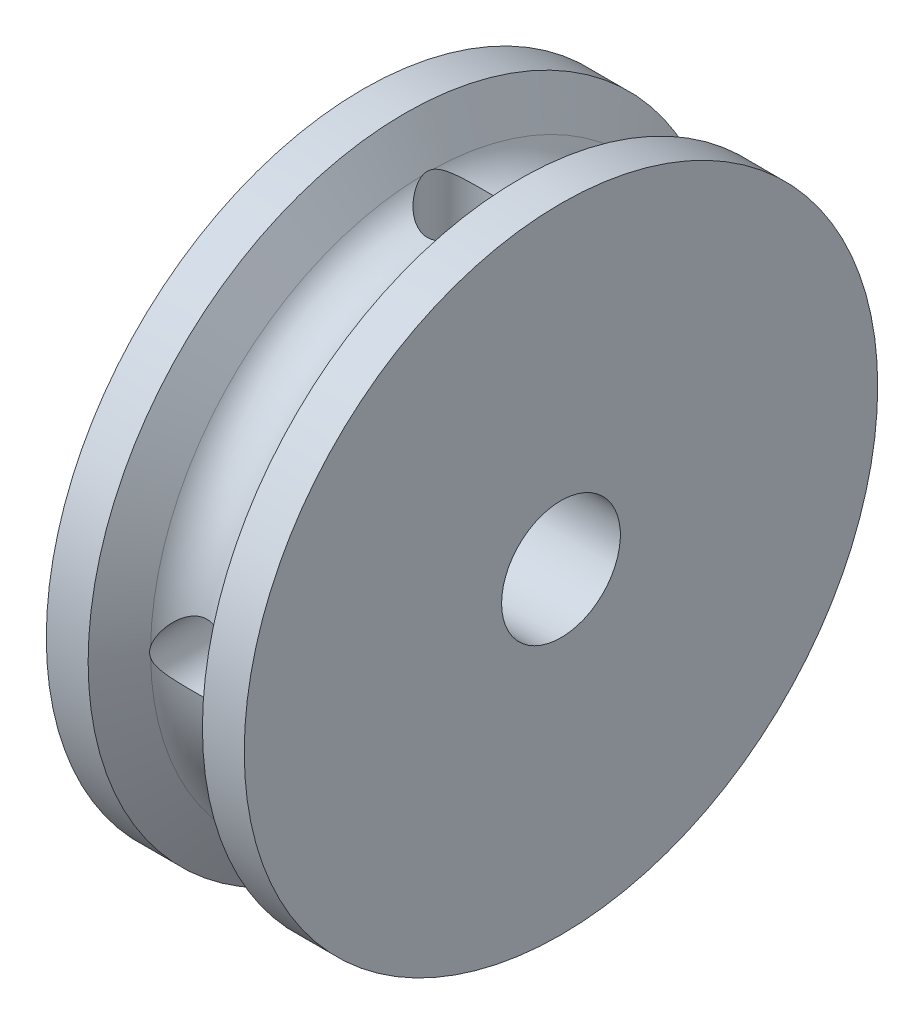
ISO-10303-21;
HEADER;
FILE_DESCRIPTION(('STEP AP214'),'2;1');
FILE_NAME('part.step','',(''),(''),'','','');
FILE_SCHEMA(('AUTOMOTIVE_DESIGN { 1 0 10303 214 1 1 1 1 }'));
ENDSEC;
DATA;
#1=APPLICATION_CONTEXT('core data for automotive mechanical design processes');
#2=APPLICATION_PROTOCOL_DEFINITION('international standard','automotive_design',2000,#1);
#3=PRODUCT_CONTEXT('',#1,'mechanical');
#4=PRODUCT('Part','Part','',(#3));
#5=PRODUCT_RELATED_PRODUCT_CATEGORY('part','',(#4));
#6=PRODUCT_DEFINITION_FORMATION('','',#4);
#7=PRODUCT_DEFINITION_CONTEXT('part definition',#1,'design');
#8=PRODUCT_DEFINITION('design','',#6,#7);
#9=PRODUCT_DEFINITION_SHAPE('','',#8);
#10=(LENGTH_UNIT() NAMED_UNIT(*) SI_UNIT(.MILLI.,.METRE.));
#11=(NAMED_UNIT(*) PLANE_ANGLE_UNIT() SI_UNIT($,.RADIAN.));
#12=(NAMED_UNIT(*) SI_UNIT($,.STERADIAN.) SOLID_ANGLE_UNIT());
#13=UNCERTAINTY_MEASURE_WITH_UNIT(LENGTH_MEASURE(1.E-05),#10,'distance_accuracy_value','');
#14=(GEOMETRIC_REPRESENTATION_CONTEXT(3) GLOBAL_UNCERTAINTY_ASSIGNED_CONTEXT((#13)) GLOBAL_UNIT_ASSIGNED_CONTEXT((#10,
#11,#12)) REPRESENTATION_CONTEXT('',''));
#15=CARTESIAN_POINT('',(0.,0.,0.));
#16=DIRECTION('',(0.,0.,1.));
#17=DIRECTION('',(1.,0.,0.));
#18=AXIS2_PLACEMENT_3D('',#15,#16,#17);
#19=CARTESIAN_POINT('',(2.88675134594812,0.,0.));
#20=DIRECTION('',(1.,0.,0.));
#21=DIRECTION('',(0.,0.,-1.));
#22=AXIS2_PLACEMENT_3D('',#19,#20,#21);
#23=CONICAL_SURFACE('',#22,16.,1.04719755119661);
#24=CARTESIAN_POINT('',(2.88675134594812,0.,0.));
#25=DIRECTION('',(-1.,0.,0.));
#26=DIRECTION('',(0.,0.,1.));
#27=AXIS2_PLACEMENT_3D('',#24,#25,#26);
#28=CIRCLE('',#27,16.);
#29=CARTESIAN_POINT('',(2.88675134594812,0.,16.));
#30=VERTEX_POINT('',#29);
#31=EDGE_CURVE('E103',#30,#30,#28,.T.);
#32=ORIENTED_EDGE('',*,*,#31,.T.);
#33=EDGE_LOOP('',(#32));
#34=FACE_BOUND('',#33,.T.);
#35=CARTESIAN_POINT('',(1.73005588832579,-0.263451367939681,13.9940650589537));
#36=CARTESIAN_POINT('',(1.73361521358024,-0.240085459690031,14.000671144653));
#37=CARTESIAN_POINT('',(1.73673176852176,-0.216426208574894,14.0064561461154));
#38=CARTESIAN_POINT('',(1.74202242324003,-0.168631286114386,14.0162774682659));
#39=CARTESIAN_POINT('',(1.74419599538915,-0.144495355928167,14.0203128099652));
#40=CARTESIAN_POINT('',(1.74911952451092,-0.072915010406253,14.0294538525908));
#41=CARTESIAN_POINT('',(1.75047315034322,-0.0249978163414377,14.0319674552401));
#42=CARTESIAN_POINT('',(1.74932660304504,0.0631541048362392,14.0298385607407));
#43=CARTESIAN_POINT('',(1.74739009249325,0.103430810911273,14.0262427243073));
#44=CARTESIAN_POINT('',(1.74079303140697,0.183937329356503,14.0139952135268));
#45=CARTESIAN_POINT('',(1.73607114028636,0.224144963866246,14.0052296914773));
#46=CARTESIAN_POINT('',(1.73005588832579,0.263451367939583,13.9940650589537));
#47=B_SPLINE_CURVE_WITH_KNOTS('',3,(#35,#36,#37,#38,#39,#40,#41,#42,#43,#44,#45,#46),
.UNSPECIFIED.,.F.,.F.,(4,2,2,2,2,4),(0.,0.0735883514783358,0.14721782494527,0.290426327950526,
0.411485687925021,0.535316186209787),.UNSPECIFIED.);
#48=CARTESIAN_POINT('',(1.73205080756901,-0.249999999999253,13.9977676791691));
#49=VERTEX_POINT('',#48);
#50=CARTESIAN_POINT('',(1.73205080756901,0.249999999999155,13.9977676791691));
#51=VERTEX_POINT('',#50);
#52=EDGE_CURVE('E180',#49,#51,#47,.T.);
#53=ORIENTED_EDGE('',*,*,#52,.F.);
#54=CARTESIAN_POINT('',(1.7320508075689,0.,0.));
#55=DIRECTION('',(-1.,0.,0.));
#56=DIRECTION('',(0.,0.,1.));
#57=AXIS2_PLACEMENT_3D('',#54,#55,#56);
#58=CIRCLE('',#57,14.);
#59=CARTESIAN_POINT('',(1.73205080756901,13.9977676791691,-0.249999999999204));
#60=VERTEX_POINT('',#59);
#61=EDGE_CURVE('E91',#60,#49,#58,.T.);
#62=ORIENTED_EDGE('',*,*,#61,.F.);
#63=CARTESIAN_POINT('',(1.73005588832579,13.9940650589537,0.263451367939632));
#64=CARTESIAN_POINT('',(1.73361521358024,14.000671144653,0.240085459689983));
#65=CARTESIAN_POINT('',(1.73673176852176,14.0064561461154,0.216426208574846));
#66=CARTESIAN_POINT('',(1.74202242324003,14.0162774682659,0.168631286114337));
#67=CARTESIAN_POINT('',(1.74419599538915,14.0203128099652,0.144495355928118));
#68=CARTESIAN_POINT('',(1.74911952451092,14.0294538525908,0.0729150104062038));
#69=CARTESIAN_POINT('',(1.75047315034322,14.0319674552401,0.0249978163413886));
#70=CARTESIAN_POINT('',(1.74932660304504,14.0298385607407,-0.0631541048362881));
#71=CARTESIAN_POINT('',(1.74739009249325,14.0262427243073,-0.103430810911322));
#72=CARTESIAN_POINT('',(1.74079303140697,14.0139952135268,-0.183937329356552));
#73=CARTESIAN_POINT('',(1.73607114028636,14.0052296914773,-0.224144963866295));
#74=CARTESIAN_POINT('',(1.73005588832579,13.9940650589537,-0.263451367939632));
#75=B_SPLINE_CURVE_WITH_KNOTS('',3,(#63,#64,#65,#66,#67,#68,#69,#70,#71,#72,#73,#74),
.UNSPECIFIED.,.F.,.F.,(4,2,2,2,2,4),(0.,0.0735883514783354,0.14721782494527,0.290426327950526,
0.411485687925021,0.535316186209787),.UNSPECIFIED.);
#76=CARTESIAN_POINT('',(1.73205080756901,13.9977676791691,0.249999999999204));
#77=VERTEX_POINT('',#76);
#78=EDGE_CURVE('E144',#77,#60,#75,.T.);
#79=ORIENTED_EDGE('',*,*,#78,.F.);
#80=EDGE_CURVE('E95',#51,#77,#58,.T.);
#81=ORIENTED_EDGE('',*,*,#80,.F.);
#82=EDGE_LOOP('',(#53,#62,#79,#81));
#83=FACE_BOUND('',#82,.T.);
#84=ADVANCED_FACE('F35',(#34,#83),#23,.T.);
#85=CARTESIAN_POINT('',(0.,0.,0.));
#86=DIRECTION('',(-1.,0.,0.));
#87=DIRECTION('',(0.,0.,1.));
#88=AXIS2_PLACEMENT_3D('',#85,#86,#87);
#89=TOROIDAL_SURFACE('',#88,15.,2.00000000000001);
#90=CARTESIAN_POINT('',(1.7322508075689,0.248610417474553,13.9981389729377));
#91=CARTESIAN_POINT('',(1.72548714169388,0.295661116791216,13.9855634664956));
#92=CARTESIAN_POINT('',(1.71696737378691,0.341474001803479,13.970029389358));
#93=CARTESIAN_POINT('',(1.69685190503831,0.430431365545228,13.9346289591729));
#94=CARTESIAN_POINT('',(1.68527229288228,0.473588386534621,13.914785360113));
#95=CARTESIAN_POINT('',(1.65948783522117,0.557226719015859,13.8723419618647));
#96=CARTESIAN_POINT('',(1.64530227813639,0.597724900932694,13.8497628033858));
#97=CARTESIAN_POINT('',(1.61443704015863,0.676676754003485,13.8026760481777));
#98=CARTESIAN_POINT('',(1.59775334672014,0.715126998506507,13.7781653795926));
#99=CARTESIAN_POINT('',(1.55483345367755,0.805227773652151,13.7178607861632));
#100=CARTESIAN_POINT('',(1.52745680238644,0.855955061150676,13.6814996492174));
#101=CARTESIAN_POINT('',(1.4682167966444,0.95400065364245,13.6078950833827));
#102=CARTESIAN_POINT('',(1.43635384939752,1.00131926743949,13.5706517348237));
#103=CARTESIAN_POINT('',(1.36798494270174,1.09288320184344,13.4961411590193));
#104=CARTESIAN_POINT('',(1.33146108293321,1.13711559945489,13.4588744220929));
#105=CARTESIAN_POINT('',(1.25378533826331,1.22222772911609,13.3853491201068));
#106=CARTESIAN_POINT('',(1.21263316639574,1.26310725300776,13.3490906177341));
#107=CARTESIAN_POINT('',(1.10490809593145,1.35982560461303,13.2616476956753));
#108=CARTESIAN_POINT('',(1.03553018553532,1.41357310804486,13.2115326703971));
#109=CARTESIAN_POINT('',(0.886323496186932,1.51157280878807,13.1184208910829));
#110=CARTESIAN_POINT('',(0.806529460262887,1.55585533580375,13.0754015040305));
#111=CARTESIAN_POINT('',(0.655911739246632,1.62403536259834,13.008355374659));
#112=CARTESIAN_POINT('',(0.587096137192738,1.65027745592897,12.982232974922));
#113=CARTESIAN_POINT('',(0.444281649584612,1.69430919646204,12.9381307135259));
#114=CARTESIAN_POINT('',(0.370285258399612,1.71210287960184,12.9201469640993));
#115=CARTESIAN_POINT('',(0.218331628483392,1.73804644103387,12.8938559105651));
#116=CARTESIAN_POINT('',(0.140349956558482,1.74612681071107,12.8856183569032));
#117=CARTESIAN_POINT('',(-0.0163697561072423,1.75167663099746,12.879965487046));
#118=CARTESIAN_POINT('',(-0.0951074344192908,1.74915093528173,12.882545220513));
#119=CARTESIAN_POINT('',(-0.241781480583217,1.73460821249544,12.8973342512644));
#120=CARTESIAN_POINT('',(-0.309945346251225,1.72367782564681,12.9084408690824));
#121=CARTESIAN_POINT('',(-0.442971658885836,1.69437951574004,12.9380283567467));
#122=CARTESIAN_POINT('',(-0.507832602084563,1.67600823844836,12.9565125522313));
#123=CARTESIAN_POINT('',(-0.654512034882657,1.62542515608635,13.0069708733386));
#124=CARTESIAN_POINT('',(-0.734594688561272,1.59063111894247,13.0413949197766));
#125=CARTESIAN_POINT('',(-0.88579635687496,1.51167979009778,13.1181996679739));
#126=CARTESIAN_POINT('',(-0.956898107752481,1.46750488985493,13.1605953156019));
#127=CARTESIAN_POINT('',(-1.11459226406754,1.35381599550224,13.2672936912154));
#128=CARTESIAN_POINT('',(-1.19722600819237,1.28096548467594,13.3339091645156));
#129=CARTESIAN_POINT('',(-1.3088849164938,1.16286877389892,13.4368444431312));
#130=CARTESIAN_POINT('',(-1.34410797581091,1.1219517394474,13.4717234538513));
#131=CARTESIAN_POINT('',(-1.41052711095003,1.03721141828463,13.5417817079152));
#132=CARTESIAN_POINT('',(-1.44172454513642,0.993389119490462,13.5769608456932));
#133=CARTESIAN_POINT('',(-1.51403752173343,0.881215396868615,13.6634628248196));
#134=CARTESIAN_POINT('',(-1.55280605600611,0.811116702182717,13.7144998137331));
#135=CARTESIAN_POINT('',(-1.62115905580025,0.663991996191487,13.8116768801317));
#136=CARTESIAN_POINT('',(-1.65080513739986,0.587017204550615,13.857848360918));
#137=CARTESIAN_POINT('',(-1.68756656989323,0.465181874098645,13.9186824791587));
#138=CARTESIAN_POINT('',(-1.69851926977201,0.42361133006672,13.9375227534438));
#139=CARTESIAN_POINT('',(-1.71762040427469,0.33795927645118,13.9712256074858));
#140=CARTESIAN_POINT('',(-1.72574945448256,0.293862740587057,13.98606054162));
#141=CARTESIAN_POINT('',(-1.73225080756889,0.248610417474648,13.9981389729377));
#142=B_SPLINE_CURVE_WITH_KNOTS('',3,(#90,#91,#92,#93,#94,#95,#96,#97,#98,#99,#100,#101,#102,
#103,#104,#105,#106,#107,#108,#109,#110,#111,#112,#113,#114,#115,#116,#117,#118,#119,#120,#121,
#122,#123,#124,#125,#126,#127,#128,#129,#130,#131,#132,#133,#134,#135,#136,#137,#138,#139,#140,
#141),.UNSPECIFIED.,.F.,.F.,(4,2,2,2,2,2,2,2,2,2,2,2,2,2,2,2,2,2,2,2,2,2,2,2,2,4),(0.,
0.147107851899977,0.293457090962717,0.438763812702035,0.584306482943818,0.788488879186764,
0.992652754501972,1.19762575365056,1.40261146861907,1.70473789234012,2.00588116085219,
2.23941454267632,2.47283624943169,2.70791856695689,2.94289331501447,3.15173950599536,
3.36067994644074,3.64068688616701,3.92122413939175,4.30522976388843,4.49792463688676,
4.69055431798351,4.97487025254637,5.25722139019067,5.397748570236,5.53922224238104),.UNSPECIFIED.);
#143=CARTESIAN_POINT('',(-1.73205080756889,0.249999999999894,13.9977676791694));
#144=VERTEX_POINT('',#143);
#145=EDGE_CURVE('E54',#51,#144,#142,.T.);
#146=ORIENTED_EDGE('',*,*,#145,.F.);
#147=ORIENTED_EDGE('',*,*,#80,.T.);
#148=CARTESIAN_POINT('',(-1.73225080756889,13.9981389729377,0.248610417474699));
#149=CARTESIAN_POINT('',(-1.72548714169387,13.9855634664956,0.295661116791366));
#150=CARTESIAN_POINT('',(-1.71696737378689,13.970029389358,0.341474001803632));
#151=CARTESIAN_POINT('',(-1.69685190503828,13.9346289591729,0.430431365545387));
#152=CARTESIAN_POINT('',(-1.68527229288225,13.9147853601129,0.473588386534783));
#153=CARTESIAN_POINT('',(-1.65948783522114,13.8723419618646,0.557226719016025));
#154=CARTESIAN_POINT('',(-1.64530227813635,13.8497628033858,0.597724900932862));
#155=CARTESIAN_POINT('',(-1.61443704015857,13.8026760481777,0.676676754003657));
#156=CARTESIAN_POINT('',(-1.59775334672009,13.7781653795926,0.715126998506682));
#157=CARTESIAN_POINT('',(-1.55483345367749,13.7178607861631,0.805227773652327));
#158=CARTESIAN_POINT('',(-1.52745680238637,13.6814996492173,0.85595506115085));
#159=CARTESIAN_POINT('',(-1.46821679664432,13.6078950833826,0.954000653642623));
#160=CARTESIAN_POINT('',(-1.43635384939743,13.5706517348237,1.00131926743966));
#161=CARTESIAN_POINT('',(-1.36798494270164,13.4961411590192,1.09288320184361));
#162=CARTESIAN_POINT('',(-1.33146108293311,13.4588744220928,1.13711559945506));
#163=CARTESIAN_POINT('',(-1.2537853382632,13.3853491201067,1.22222772911625));
#164=CARTESIAN_POINT('',(-1.21263316639561,13.349090617734,1.26310725300792));
#165=CARTESIAN_POINT('',(-1.10490809593132,13.2616476956752,1.35982560461318));
#166=CARTESIAN_POINT('',(-1.03553018553519,13.2115326703971,1.41357310804499));
#167=CARTESIAN_POINT('',(-0.886323496186809,13.1184208910828,1.51157280878819));
#168=CARTESIAN_POINT('',(-0.806529460262769,13.0754015040304,1.55585533580386));
#169=CARTESIAN_POINT('',(-0.655911739246518,13.0083553746589,1.62403536259843));
#170=CARTESIAN_POINT('',(-0.587096137192624,12.9822329749219,1.65027745592905));
#171=CARTESIAN_POINT('',(-0.444281649584499,12.9381307135258,1.69430919646211));
#172=CARTESIAN_POINT('',(-0.3702852583995,12.9201469640992,1.71210287960191));
#173=CARTESIAN_POINT('',(-0.218331628483284,12.893855910565,1.73804644103393));
#174=CARTESIAN_POINT('',(-0.140349956558376,12.8856183569032,1.74612681071112));
#175=CARTESIAN_POINT('',(0.016369756107342,12.879965487046,1.75167663099751));
#176=CARTESIAN_POINT('',(0.0951074344193869,12.882545220513,1.74915093528177));
#177=CARTESIAN_POINT('',(0.241781480583308,12.8973342512644,1.73460821249547));
#178=CARTESIAN_POINT('',(0.309945346251314,12.9084408690824,1.72367782564684));
#179=CARTESIAN_POINT('',(0.442971658885921,12.9380283567467,1.69437951574006));
#180=CARTESIAN_POINT('',(0.507832602084646,12.9565125522313,1.67600823844838));
#181=CARTESIAN_POINT('',(0.65451203488274,13.0069708733386,1.62542515608636));
#182=CARTESIAN_POINT('',(0.734594688561356,13.0413949197767,1.59063111894248));
#183=CARTESIAN_POINT('',(0.885796356875046,13.1181996679739,1.51167979009778));
#184=CARTESIAN_POINT('',(0.956898107752567,13.160595315602,1.46750488985492));
#185=CARTESIAN_POINT('',(1.11459226406763,13.2672936912154,1.35381599550222));
#186=CARTESIAN_POINT('',(1.19722600819245,13.3339091645156,1.28096548467591));
#187=CARTESIAN_POINT('',(1.30888491649388,13.4368444431313,1.16286877389888));
#188=CARTESIAN_POINT('',(1.34410797581099,13.4717234538514,1.12195173944735));
#189=CARTESIAN_POINT('',(1.41052711095011,13.5417817079153,1.03721141828457));
#190=CARTESIAN_POINT('',(1.44172454513649,13.5769608456932,0.993389119490404));
#191=CARTESIAN_POINT('',(1.51403752173349,13.6634628248196,0.88121539686856));
#192=CARTESIAN_POINT('',(1.55280605600616,13.7144998137331,0.811116702182668));
#193=CARTESIAN_POINT('',(1.62115905580028,13.8116768801318,0.663991996191455));
#194=CARTESIAN_POINT('',(1.65080513739989,13.857848360918,0.587017204550591));
#195=CARTESIAN_POINT('',(1.68756656989325,13.9186824791587,0.465181874098626));
#196=CARTESIAN_POINT('',(1.69851926977203,13.9375227534438,0.423611330066696));
#197=CARTESIAN_POINT('',(1.7176204042747,13.9712256074858,0.337959276451144));
#198=CARTESIAN_POINT('',(1.72574945448258,13.98606054162,0.293862740587015));
#199=CARTESIAN_POINT('',(1.7322508075689,13.9981389729377,0.248610417474601));
#200=B_SPLINE_CURVE_WITH_KNOTS('',3,(#148,#149,#150,#151,#152,#153,#154,#155,#156,#157,#158,
#159,#160,#161,#162,#163,#164,#165,#166,#167,#168,#169,#170,#171,#172,#173,#174,#175,#176,#177,
#178,#179,#180,#181,#182,#183,#184,#185,#186,#187,#188,#189,#190,#191,#192,#193,#194,#195,#196,
#197,#198,#199),.UNSPECIFIED.,.F.,.F.,(4,2,2,2,2,2,2,2,2,2,2,2,2,2,2,2,2,2,2,2,2,2,2,2,2,4),(0.,
0.147107851899995,0.293457090962752,0.438763812702085,0.584306482943885,0.788488879186841,
0.992652754502061,1.19762575365066,1.40261146861918,1.7047378923402,2.00588116085224,
2.23941454267635,2.47283624943171,2.7079185669569,2.94289331501447,3.15173950599536,
3.36067994644074,3.64068688616703,3.92122413939178,4.30522976388848,4.49792463688681,
4.69055431798357,4.97487025254639,5.25722139019064,5.39774857023599,5.53922224238104),.UNSPECIFIED.);
#201=CARTESIAN_POINT('',(-1.73205080756889,13.9977676791694,0.249999999999943));
#202=VERTEX_POINT('',#201);
#203=EDGE_CURVE('E135',#202,#77,#200,.T.);
#204=ORIENTED_EDGE('',*,*,#203,.F.);
#205=CARTESIAN_POINT('',(-1.73205080756889,0.,0.));
#206=DIRECTION('',(-1.,0.,0.));
#207=DIRECTION('',(0.,0.,1.));
#208=AXIS2_PLACEMENT_3D('',#205,#206,#207);
#209=CIRCLE('',#208,14.);
#210=EDGE_CURVE('E96',#144,#202,#209,.T.);
#211=ORIENTED_EDGE('',*,*,#210,.F.);
#212=EDGE_LOOP('',(#146,#147,#204,#211));
#213=FACE_BOUND('',#212,.T.);
#214=ADVANCED_FACE('F149',(#213),#89,.F.);
#215=CARTESIAN_POINT('',(-1.73225080756889,-0.248610417474747,13.9981389729377));
#216=CARTESIAN_POINT('',(-1.72548714169387,-0.295661116791414,13.9855634664956));
#217=CARTESIAN_POINT('',(-1.71696737378689,-0.341474001803681,13.970029389358));
#218=CARTESIAN_POINT('',(-1.69685190503828,-0.430431365545435,13.9346289591729));
#219=CARTESIAN_POINT('',(-1.68527229288225,-0.47358838653483,13.9147853601129));
#220=CARTESIAN_POINT('',(-1.65948783522114,-0.557226719016072,13.8723419618646));
#221=CARTESIAN_POINT('',(-1.64530227813635,-0.59772490093291,13.8497628033858));
#222=CARTESIAN_POINT('',(-1.61443704015857,-0.676676754003705,13.8026760481777));
#223=CARTESIAN_POINT('',(-1.59775334672009,-0.71512699850673,13.7781653795926));
#224=CARTESIAN_POINT('',(-1.55483345367749,-0.805227773652375,13.7178607861631));
#225=CARTESIAN_POINT('',(-1.52745680238637,-0.855955061150898,13.6814996492173));
#226=CARTESIAN_POINT('',(-1.46821679664432,-0.95400065364267,13.6078950833826));
#227=CARTESIAN_POINT('',(-1.43635384939743,-1.00131926743971,13.5706517348237));
#228=CARTESIAN_POINT('',(-1.36798494270164,-1.09288320184366,13.4961411590192));
#229=CARTESIAN_POINT('',(-1.33146108293311,-1.13711559945511,13.4588744220928));
#230=CARTESIAN_POINT('',(-1.2537853382632,-1.2222277291163,13.3853491201067));
#231=CARTESIAN_POINT('',(-1.21263316639561,-1.26310725300797,13.349090617734));
#232=CARTESIAN_POINT('',(-1.10490809593132,-1.35982560461323,13.2616476956752));
#233=CARTESIAN_POINT('',(-1.03553018553519,-1.41357310804504,13.2115326703971));
#234=CARTESIAN_POINT('',(-0.886323496186809,-1.51157280878823,13.1184208910828));
#235=CARTESIAN_POINT('',(-0.806529460262769,-1.55585533580391,13.0754015040304));
#236=CARTESIAN_POINT('',(-0.655911739246518,-1.62403536259847,13.0083553746589));
#237=CARTESIAN_POINT('',(-0.587096137192624,-1.6502774559291,12.9822329749219));
#238=CARTESIAN_POINT('',(-0.444281649584498,-1.69430919646216,12.9381307135258));
#239=CARTESIAN_POINT('',(-0.370285258399499,-1.71210287960196,12.9201469640992));
#240=CARTESIAN_POINT('',(-0.218331628483282,-1.73804644103397,12.893855910565));
#241=CARTESIAN_POINT('',(-0.140349956558375,-1.74612681071117,12.8856183569032));
#242=CARTESIAN_POINT('',(0.016369756107343,-1.75167663099755,12.879965487046));
#243=CARTESIAN_POINT('',(0.0951074344193877,-1.74915093528182,12.882545220513));
#244=CARTESIAN_POINT('',(0.241781480583308,-1.73460821249552,12.8973342512644));
#245=CARTESIAN_POINT('',(0.309945346251314,-1.72367782564689,12.9084408690824));
#246=CARTESIAN_POINT('',(0.442971658885922,-1.69437951574011,12.9380283567467));
#247=CARTESIAN_POINT('',(0.507832602084647,-1.67600823844842,12.9565125522313));
#248=CARTESIAN_POINT('',(0.65451203488274,-1.6254251560864,13.0069708733386));
#249=CARTESIAN_POINT('',(0.734594688561356,-1.59063111894253,13.0413949197767));
#250=CARTESIAN_POINT('',(0.885796356875045,-1.51167979009782,13.1181996679739));
#251=CARTESIAN_POINT('',(0.956898107752566,-1.46750488985497,13.160595315602));
#252=CARTESIAN_POINT('',(1.11459226406763,-1.35381599550226,13.2672936912154));
#253=CARTESIAN_POINT('',(1.19722600819245,-1.28096548467596,13.3339091645156));
#254=CARTESIAN_POINT('',(1.30888491649388,-1.16286877389893,13.4368444431313));
#255=CARTESIAN_POINT('',(1.34410797581099,-1.1219517394474,13.4717234538513));
#256=CARTESIAN_POINT('',(1.41052711095011,-1.03721141828462,13.5417817079153));
#257=CARTESIAN_POINT('',(1.44172454513649,-0.993389119490452,13.5769608456932));
#258=CARTESIAN_POINT('',(1.51403752173349,-0.881215396868609,13.6634628248196));
#259=CARTESIAN_POINT('',(1.55280605600616,-0.811116702182717,13.7144998137331));
#260=CARTESIAN_POINT('',(1.62115905580028,-0.663991996191505,13.8116768801318));
#261=CARTESIAN_POINT('',(1.65080513739989,-0.587017204550641,13.857848360918));
#262=CARTESIAN_POINT('',(1.68756656989324,-0.465181874098676,13.9186824791587));
#263=CARTESIAN_POINT('',(1.69851926977203,-0.423611330066746,13.9375227534438));
#264=CARTESIAN_POINT('',(1.7176204042747,-0.337959276451195,13.9712256074858));
#265=CARTESIAN_POINT('',(1.72574945448257,-0.293862740587066,13.98606054162));
#266=CARTESIAN_POINT('',(1.7322508075689,-0.248610417474652,13.9981389729377));
#267=B_SPLINE_CURVE_WITH_KNOTS('',3,(#215,#216,#217,#218,#219,#220,#221,#222,#223,#224,#225,
#226,#227,#228,#229,#230,#231,#232,#233,#234,#235,#236,#237,#238,#239,#240,#241,#242,#243,#244,
#245,#246,#247,#248,#249,#250,#251,#252,#253,#254,#255,#256,#257,#258,#259,#260,#261,#262,#263,
#264,#265,#266),.UNSPECIFIED.,.F.,.F.,(4,2,2,2,2,2,2,2,2,2,2,2,2,2,2,2,2,2,2,2,2,2,2,2,2,4),(0.,
0.147107851899994,0.293457090962751,0.438763812702084,0.584306482943885,0.788488879186842,
0.992652754502061,1.19762575365066,1.40261146861918,1.7047378923402,2.00588116085224,
2.23941454267635,2.47283624943171,2.7079185669569,2.94289331501447,3.15173950599536,
3.36067994644074,3.64068688616703,3.92122413939178,4.30522976388847,4.49792463688681,
4.69055431798357,4.97487025254639,5.25722139019064,5.39774857023599,5.53922224238104),.UNSPECIFIED.);
#268=CARTESIAN_POINT('',(-1.73205080756889,-0.249999999999992,13.9977676791694));
#269=VERTEX_POINT('',#268);
#270=EDGE_CURVE('E80',#269,#49,#267,.T.);
#271=ORIENTED_EDGE('',*,*,#270,.F.);
#272=CARTESIAN_POINT('',(-1.73205080756889,13.9977676791694,-0.249999999999943));
#273=VERTEX_POINT('',#272);
#274=EDGE_CURVE('E89',#273,#269,#209,.T.);
#275=ORIENTED_EDGE('',*,*,#274,.F.);
#276=CARTESIAN_POINT('',(1.7322508075689,13.9981389729377,-0.248610417474602));
#277=CARTESIAN_POINT('',(1.72548714169388,13.9855634664956,-0.295661116791265));
#278=CARTESIAN_POINT('',(1.71696737378691,13.970029389358,-0.341474001803528));
#279=CARTESIAN_POINT('',(1.69685190503831,13.9346289591729,-0.430431365545276));
#280=CARTESIAN_POINT('',(1.68527229288228,13.9147853601129,-0.473588386534669));
#281=CARTESIAN_POINT('',(1.65948783522117,13.8723419618647,-0.557226719015906));
#282=CARTESIAN_POINT('',(1.64530227813639,13.8497628033858,-0.597724900932742));
#283=CARTESIAN_POINT('',(1.61443704015863,13.8026760481777,-0.676676754003533));
#284=CARTESIAN_POINT('',(1.59775334672014,13.7781653795926,-0.715126998506555));
#285=CARTESIAN_POINT('',(1.55483345367755,13.7178607861632,-0.8052277736522));
#286=CARTESIAN_POINT('',(1.52745680238644,13.6814996492174,-0.855955061150723));
#287=CARTESIAN_POINT('',(1.4682167966444,13.6078950833827,-0.954000653642498));
#288=CARTESIAN_POINT('',(1.43635384939752,13.5706517348237,-1.00131926743954));
#289=CARTESIAN_POINT('',(1.36798494270174,13.4961411590193,-1.09288320184349));
#290=CARTESIAN_POINT('',(1.33146108293322,13.4588744220929,-1.13711559945494));
#291=CARTESIAN_POINT('',(1.25378533826331,13.3853491201068,-1.22222772911613));
#292=CARTESIAN_POINT('',(1.21263316639574,13.3490906177341,-1.26310725300781));
#293=CARTESIAN_POINT('',(1.10490809593145,13.2616476956753,-1.35982560461308));
#294=CARTESIAN_POINT('',(1.03553018553531,13.2115326703971,-1.4135731080449));
#295=CARTESIAN_POINT('',(0.886323496186932,13.1184208910829,-1.51157280878812));
#296=CARTESIAN_POINT('',(0.806529460262887,13.0754015040305,-1.5558553358038));
#297=CARTESIAN_POINT('',(0.655911739246632,13.008355374659,-1.62403536259838));
#298=CARTESIAN_POINT('',(0.587096137192739,12.982232974922,-1.65027745592901));
#299=CARTESIAN_POINT('',(0.444281649584612,12.9381307135258,-1.69430919646208));
#300=CARTESIAN_POINT('',(0.370285258399613,12.9201469640993,-1.71210287960189));
#301=CARTESIAN_POINT('',(0.218331628483393,12.8938559105651,-1.73804644103391));
#302=CARTESIAN_POINT('',(0.140349956558483,12.8856183569032,-1.74612681071111));
#303=CARTESIAN_POINT('',(-0.0163697561072419,12.879965487046,-1.75167663099751));
#304=CARTESIAN_POINT('',(-0.0951074344192906,12.882545220513,-1.74915093528178));
#305=CARTESIAN_POINT('',(-0.241781480583216,12.8973342512644,-1.73460821249548));
#306=CARTESIAN_POINT('',(-0.309945346251224,12.9084408690824,-1.72367782564686));
#307=CARTESIAN_POINT('',(-0.442971658885835,12.9380283567467,-1.69437951574008));
#308=CARTESIAN_POINT('',(-0.507832602084563,12.9565125522313,-1.6760082384484));
#309=CARTESIAN_POINT('',(-0.654512034882657,13.0069708733386,-1.62542515608639));
#310=CARTESIAN_POINT('',(-0.734594688561272,13.0413949197766,-1.59063111894252));
#311=CARTESIAN_POINT('',(-0.88579635687496,13.1181996679738,-1.51167979009783));
#312=CARTESIAN_POINT('',(-0.956898107752481,13.1605953156019,-1.46750488985498));
#313=CARTESIAN_POINT('',(-1.11459226406754,13.2672936912154,-1.35381599550229));
#314=CARTESIAN_POINT('',(-1.19722600819237,13.3339091645156,-1.28096548467599));
#315=CARTESIAN_POINT('',(-1.3088849164938,13.4368444431312,-1.16286877389897));
#316=CARTESIAN_POINT('',(-1.34410797581091,13.4717234538513,-1.12195173944745));
#317=CARTESIAN_POINT('',(-1.41052711095003,13.5417817079152,-1.03721141828468));
#318=CARTESIAN_POINT('',(-1.44172454513642,13.5769608456932,-0.993389119490511));
#319=CARTESIAN_POINT('',(-1.51403752173343,13.6634628248196,-0.881215396868665));
#320=CARTESIAN_POINT('',(-1.55280605600611,13.7144998137331,-0.811116702182765));
#321=CARTESIAN_POINT('',(-1.62115905580025,13.8116768801317,-0.663991996191537));
#322=CARTESIAN_POINT('',(-1.65080513739986,13.857848360918,-0.587017204550666));
#323=CARTESIAN_POINT('',(-1.68756656989323,13.9186824791587,-0.465181874098695));
#324=CARTESIAN_POINT('',(-1.69851926977201,13.9375227534438,-0.423611330066771));
#325=CARTESIAN_POINT('',(-1.71762040427469,13.9712256074858,-0.33795927645123));
#326=CARTESIAN_POINT('',(-1.72574945448256,13.98606054162,-0.293862740587106));
#327=CARTESIAN_POINT('',(-1.73225080756889,13.9981389729377,-0.248610417474699));
#328=B_SPLINE_CURVE_WITH_KNOTS('',3,(#276,#277,#278,#279,#280,#281,#282,#283,#284,#285,#286,
#287,#288,#289,#290,#291,#292,#293,#294,#295,#296,#297,#298,#299,#300,#301,#302,#303,#304,#305,
#306,#307,#308,#309,#310,#311,#312,#313,#314,#315,#316,#317,#318,#319,#320,#321,#322,#323,#324,
#325,#326,#327),.UNSPECIFIED.,.F.,.F.,(4,2,2,2,2,2,2,2,2,2,2,2,2,2,2,2,2,2,2,2,2,2,2,2,2,4),(0.,
0.147107851899977,0.293457090962717,0.438763812702034,0.584306482943817,0.788488879186763,
0.992652754501972,1.19762575365056,1.40261146861907,1.70473789234012,2.00588116085219,
2.23941454267632,2.47283624943169,2.70791856695689,2.94289331501447,3.15173950599536,
3.36067994644074,3.64068688616701,3.92122413939175,4.30522976388843,4.49792463688676,
4.69055431798351,4.97487025254637,5.25722139019067,5.397748570236,5.53922224238104),.UNSPECIFIED.);
#329=EDGE_CURVE('E62',#60,#273,#328,.T.);
#330=ORIENTED_EDGE('',*,*,#329,.F.);
#331=ORIENTED_EDGE('',*,*,#61,.T.);
#332=EDGE_LOOP('',(#271,#275,#330,#331));
#333=FACE_BOUND('',#332,.T.);
#334=ADVANCED_FACE('F88',(#333),#89,.F.);
#335=CARTESIAN_POINT('',(-1.73205080756889,0.,0.));
#336=DIRECTION('',(-1.,0.,0.));
#337=DIRECTION('',(0.,0.,1.));
#338=AXIS2_PLACEMENT_3D('',#335,#336,#337);
#339=CONICAL_SURFACE('',#338,14.,1.0471975511966);
#340=CARTESIAN_POINT('',(-2.88675134594812,0.,0.));
#341=DIRECTION('',(-1.,0.,0.));
#342=DIRECTION('',(0.,0.,1.));
#343=AXIS2_PLACEMENT_3D('',#340,#341,#342);
#344=CIRCLE('',#343,16.);
#345=CARTESIAN_POINT('',(-2.88675134594812,0.,16.));
#346=VERTEX_POINT('',#345);
#347=EDGE_CURVE('E99',#346,#346,#344,.T.);
#348=ORIENTED_EDGE('',*,*,#347,.F.);
#349=EDGE_LOOP('',(#348));
#350=FACE_BOUND('',#349,.T.);
#351=CARTESIAN_POINT('',(-1.73005588832577,0.263451367939686,13.9940650589537));
#352=CARTESIAN_POINT('',(-1.73361521358022,0.240085459690036,14.000671144653));
#353=CARTESIAN_POINT('',(-1.73673176852175,0.216426208574899,14.0064561461154));
#354=CARTESIAN_POINT('',(-1.74202242324002,0.16863128611439,14.0162774682659));
#355=CARTESIAN_POINT('',(-1.74419599538914,0.14449535592817,14.0203128099652));
#356=CARTESIAN_POINT('',(-1.74911952451091,0.0729150104062547,14.0294538525908));
#357=CARTESIAN_POINT('',(-1.75047315034322,0.0249978163414381,14.0319674552401));
#358=CARTESIAN_POINT('',(-1.74932660304504,-0.0631541048362735,14.0298385607408));
#359=CARTESIAN_POINT('',(-1.74739009249325,-0.103430810911341,14.0262427243073));
#360=CARTESIAN_POINT('',(-1.74079303140696,-0.183937329356637,14.0139952135268));
#361=CARTESIAN_POINT('',(-1.73607114028635,-0.224144963866414,14.0052296914774));
#362=CARTESIAN_POINT('',(-1.73005588832578,-0.263451367939782,13.9940650589537));
#363=B_SPLINE_CURVE_WITH_KNOTS('',3,(#351,#352,#353,#354,#355,#356,#357,#358,#359,#360,#361,
#362),.UNSPECIFIED.,.F.,.F.,(4,2,2,2,2,4),(0.,0.0735883514783386,0.147217824945276,
0.290426327950537,0.41148568792513,0.53531618621),.UNSPECIFIED.);
#364=EDGE_CURVE('E11',#144,#269,#363,.T.);
#365=ORIENTED_EDGE('',*,*,#364,.F.);
#366=ORIENTED_EDGE('',*,*,#210,.T.);
#367=CARTESIAN_POINT('',(-1.73005588832577,13.9940650589537,-0.263451367939733));
#368=CARTESIAN_POINT('',(-1.73361521358022,14.000671144653,-0.240085459690084));
#369=CARTESIAN_POINT('',(-1.73673176852175,14.0064561461154,-0.216426208574946));
#370=CARTESIAN_POINT('',(-1.74202242324002,14.0162774682659,-0.168631286114437));
#371=CARTESIAN_POINT('',(-1.74419599538914,14.0203128099652,-0.144495355928217));
#372=CARTESIAN_POINT('',(-1.74911952451091,14.0294538525908,-0.0729150104063017));
#373=CARTESIAN_POINT('',(-1.75047315034322,14.0319674552401,-0.0249978163414854));
#374=CARTESIAN_POINT('',(-1.74932660304504,14.0298385607408,0.0631541048362258));
#375=CARTESIAN_POINT('',(-1.74739009249325,14.0262427243073,0.103430810911293));
#376=CARTESIAN_POINT('',(-1.74079303140696,14.0139952135268,0.183937329356588));
#377=CARTESIAN_POINT('',(-1.73607114028635,14.0052296914774,0.224144963866365));
#378=CARTESIAN_POINT('',(-1.73005588832578,13.9940650589537,0.263451367939733));
#379=B_SPLINE_CURVE_WITH_KNOTS('',3,(#367,#368,#369,#370,#371,#372,#373,#374,#375,#376,#377,
#378),.UNSPECIFIED.,.F.,.F.,(4,2,2,2,2,4),(0.,0.0735883514783388,0.147217824945276,
0.290426327950537,0.411485687925129,0.535316186209998),.UNSPECIFIED.);
#380=EDGE_CURVE('E48',#273,#202,#379,.T.);
#381=ORIENTED_EDGE('',*,*,#380,.F.);
#382=ORIENTED_EDGE('',*,*,#274,.T.);
#383=EDGE_LOOP('',(#365,#366,#381,#382));
#384=FACE_BOUND('',#383,.T.);
#385=ADVANCED_FACE('F94',(#350,#384),#339,.T.);
#386=CARTESIAN_POINT('',(-76.1578078160598,0.,0.));
#387=DIRECTION('',(-1.,0.,0.));
#388=DIRECTION('',(0.,0.,1.));
#389=AXIS2_PLACEMENT_3D('',#386,#387,#388);
#390=CYLINDRICAL_SURFACE('',#389,16.);
#391=CARTESIAN_POINT('',(-5.,0.,0.));
#392=DIRECTION('',(-1.,0.,0.));
#393=DIRECTION('',(0.,0.,1.));
#394=AXIS2_PLACEMENT_3D('',#391,#392,#393);
#395=CIRCLE('',#394,16.);
#396=CARTESIAN_POINT('',(-5.,0.,16.));
#397=VERTEX_POINT('',#396);
#398=EDGE_CURVE('E115',#397,#397,#395,.T.);
#399=ORIENTED_EDGE('',*,*,#398,.F.);
#400=EDGE_LOOP('',(#399));
#401=FACE_BOUND('',#400,.T.);
#402=ORIENTED_EDGE('',*,*,#347,.T.);
#403=EDGE_LOOP('',(#402));
#404=FACE_BOUND('',#403,.T.);
#405=ADVANCED_FACE('F37',(#401,#404),#390,.T.);
#406=CARTESIAN_POINT('',(-5.,16.,0.));
#407=DIRECTION('',(1.,0.,0.));
#408=DIRECTION('',(0.,0.,-1.));
#409=AXIS2_PLACEMENT_3D('',#406,#407,#408);
#410=PLANE('',#409);
#411=CARTESIAN_POINT('',(-5.,0.,0.));
#412=DIRECTION('',(-1.,0.,0.));
#413=DIRECTION('',(0.,0.,1.));
#414=AXIS2_PLACEMENT_3D('',#411,#412,#413);
#415=CIRCLE('',#414,3.);
#416=CARTESIAN_POINT('',(-5.,0.,3.));
#417=VERTEX_POINT('',#416);
#418=EDGE_CURVE('E112',#417,#417,#415,.T.);
#419=ORIENTED_EDGE('',*,*,#418,.F.);
#420=EDGE_LOOP('',(#419));
#421=FACE_BOUND('',#420,.T.);
#422=ORIENTED_EDGE('',*,*,#398,.T.);
#423=EDGE_LOOP('',(#422));
#424=FACE_BOUND('',#423,.T.);
#425=ADVANCED_FACE('F211',(#421,#424),#410,.F.);
#426=CARTESIAN_POINT('',(-76.1578078160598,0.,0.));
#427=DIRECTION('',(-1.,0.,0.));
#428=DIRECTION('',(0.,0.,1.));
#429=AXIS2_PLACEMENT_3D('',#426,#427,#428);
#430=CYLINDRICAL_SURFACE('',#429,3.);
#431=CARTESIAN_POINT('',(1.24999999999999,0.,3.));
#432=CARTESIAN_POINT('',(1.24999279490869,0.0669580526362666,2.99999458367273));
#433=CARTESIAN_POINT('',(1.24458804147186,0.13402139706384,2.9977323297471));
#434=CARTESIAN_POINT('',(1.22316093507981,0.266247371156346,2.98890153579552));
#435=CARTESIAN_POINT('',(1.20711087553574,0.331404576423563,2.98232175901028));
#436=CARTESIAN_POINT('',(1.1650889082194,0.457688733653085,2.96556289038127));
#437=CARTESIAN_POINT('',(1.13915061053184,0.518828524426265,2.95539599975004));
#438=CARTESIAN_POINT('',(1.07822717676742,0.635829756679798,2.93245286470664));
#439=CARTESIAN_POINT('',(1.04324478102912,0.691692790015935,2.91967741092849));
#440=CARTESIAN_POINT('',(0.963371017409106,0.799448403559506,2.89207828351869));
#441=CARTESIAN_POINT('',(0.918098691210234,0.851041267517762,2.87718753326093));
#442=CARTESIAN_POINT('',(0.819735665217416,0.946159821091255,2.84732714068514));
#443=CARTESIAN_POINT('',(0.766640875105479,0.989681263153077,2.8323574610681));
#444=CARTESIAN_POINT('',(0.65097322243509,1.06953737697065,2.80321021812995));
#445=CARTESIAN_POINT('',(0.588062551573441,1.10541308153924,2.78910786873385));
#446=CARTESIAN_POINT('',(0.456426742079055,1.16593940588864,2.76435572357005));
#447=CARTESIAN_POINT('',(0.387704620515534,1.19059580836289,2.75370415000824));
#448=CARTESIAN_POINT('',(0.249846308232065,1.22674598312157,2.73778555387705));
#449=CARTESIAN_POINT('',(0.180889516607832,1.23881657877604,2.73228387651788));
#450=CARTESIAN_POINT('',(0.0417267073134171,1.25125209967795,2.72661326219505));
#451=CARTESIAN_POINT('',(-0.0284786000257516,1.25162348054396,2.72644138425261));
#452=CARTESIAN_POINT('',(-0.162400060434949,1.24108450363672,2.73125119560853));
#453=CARTESIAN_POINT('',(-0.226201096564472,1.23103681112299,2.73583882723624));
#454=CARTESIAN_POINT('',(-0.351112091000399,1.20139191015775,2.74898482773797));
#455=CARTESIAN_POINT('',(-0.412221531491781,1.18179287287175,2.75754395703564));
#456=CARTESIAN_POINT('',(-0.53155770299145,1.13321958727569,2.77786184772757));
#457=CARTESIAN_POINT('',(-0.589695420913386,1.10405471539234,2.78968481949137));
#458=CARTESIAN_POINT('',(-0.700477733880152,1.0373124258056,2.81518331141087));
#459=CARTESIAN_POINT('',(-0.753120150613522,0.999731690519521,2.8288595612978));
#460=CARTESIAN_POINT('',(-0.856099958732842,0.913495965543812,2.8579297687798));
#461=CARTESIAN_POINT('',(-0.905866567385439,0.864173483207502,2.87337121404473));
#462=CARTESIAN_POINT('',(-0.996613502959184,0.757729591051487,2.9032567311253));
#463=CARTESIAN_POINT('',(-1.03759177169218,0.700606359448432,2.9177005687701));
#464=CARTESIAN_POINT('',(-1.11043582361627,0.578447948693351,2.94438283556473));
#465=CARTESIAN_POINT('',(-1.14206944515068,0.513260582447655,2.95656266543334));
#466=CARTESIAN_POINT('',(-1.19372113960326,0.377852402526807,2.97689481414804));
#467=CARTESIAN_POINT('',(-1.21374563194381,0.30763439479501,2.985049358458));
#468=CARTESIAN_POINT('',(-1.24041599212663,0.168928113346204,2.99599641186385));
#469=CARTESIAN_POINT('',(-1.24782785744374,0.100611285278615,2.99909541047125));
#470=CARTESIAN_POINT('',(-1.25134622361409,-0.0363546554961117,3.00056050368745));
#471=CARTESIAN_POINT('',(-1.24745597025199,-0.105003667152658,2.99892795711939));
#472=CARTESIAN_POINT('',(-1.22902891519392,-0.237098242341456,2.9913121765694));
#473=CARTESIAN_POINT('',(-1.21503004590279,-0.300632966639406,2.98554887283989));
#474=CARTESIAN_POINT('',(-1.1775318054592,-0.424382748971109,2.97048606772414));
#475=CARTESIAN_POINT('',(-1.15403123404969,-0.484597386518379,2.96118611959703));
#476=CARTESIAN_POINT('',(-1.09742902428787,-0.602108999869154,2.93958270645165));
#477=CARTESIAN_POINT('',(-1.06405181685395,-0.659257236855341,2.92719491469281));
#478=CARTESIAN_POINT('',(-0.988946622208291,-0.767346216231445,2.9007380457909));
#479=CARTESIAN_POINT('',(-0.947215148470712,-0.818284352601956,2.88666826768733));
#480=CARTESIAN_POINT('',(-0.853096766727578,-0.916333430274277,2.85712087895437));
#481=CARTESIAN_POINT('',(-0.800161497013724,-0.962910697979848,2.84161451591028));
#482=CARTESIAN_POINT('',(-0.686978724064592,-1.04666984610552,2.81184336768005));
#483=CARTESIAN_POINT('',(-0.626729564828251,-1.08384959285618,2.79757886493438));
#484=CARTESIAN_POINT('',(-0.499385824697408,-1.148159602087,2.77181386243988));
#485=CARTESIAN_POINT('',(-0.432205964485153,-1.1751391823733,2.76035562555111));
#486=CARTESIAN_POINT('',(-0.293629406189879,-1.21717413951573,2.74208355658957));
#487=CARTESIAN_POINT('',(-0.222236237516637,-1.23223934863688,2.73526589555752));
#488=CARTESIAN_POINT('',(-0.0831813008007767,-1.24904080348901,2.72763164537264));
#489=CARTESIAN_POINT('',(-0.0156553377073713,-1.25171380413129,2.72639350967163));
#490=CARTESIAN_POINT('',(0.118842861141113,-1.24615575523912,2.72893853011024));
#491=CARTESIAN_POINT('',(0.185815180313706,-1.23792637964721,2.73272091540306));
#492=CARTESIAN_POINT('',(0.3140927474689,-1.21158404780491,2.74449551302268));
#493=CARTESIAN_POINT('',(0.375516673463401,-1.19394903571466,2.7522835484648));
#494=CARTESIAN_POINT('',(0.494548021357236,-1.14976328202134,2.77103181199189));
#495=CARTESIAN_POINT('',(0.552154365398791,-1.12321003517252,2.78199293131693));
#496=CARTESIAN_POINT('',(0.66569589594913,-1.06010285935489,2.80666954560013));
#497=CARTESIAN_POINT('',(0.721322330168296,-1.02304360910483,2.8205110271368));
#498=CARTESIAN_POINT('',(0.825860139360685,-0.940684072630386,2.84903689053839));
#499=CARTESIAN_POINT('',(0.874769175600577,-0.895380928905614,2.86372156345875));
#500=CARTESIAN_POINT('',(0.968148681684747,-0.793902045778815,2.89356392850106));
#501=CARTESIAN_POINT('',(1.01203643284065,-0.737174739949022,2.90867817511792));
#502=CARTESIAN_POINT('',(1.08969945354363,-0.616600079253193,2.9366014362202));
#503=CARTESIAN_POINT('',(1.12347011488955,-0.552749497945739,2.9494093991674));
#504=CARTESIAN_POINT('',(1.17920984543988,-0.420732056717944,2.97109183362461));
#505=CARTESIAN_POINT('',(1.2013647666173,-0.352653990980629,2.98002782581964));
#506=CARTESIAN_POINT('',(1.23370632907783,-0.213410421846553,2.99321009768625));
#507=CARTESIAN_POINT('',(1.24393044252988,-0.142255316980952,2.99747105811967));
#508=CARTESIAN_POINT('',(1.24933316108644,-0.0472360819191803,2.99972287568934));
#509=CARTESIAN_POINT('',(1.25000254214922,-0.0236245946756556,3.00000191102536));
#510=CARTESIAN_POINT('',(1.24999999999999,0.,3.));
#511=B_SPLINE_CURVE_WITH_KNOTS('',3,(#431,#432,#433,#434,#435,#436,#437,#438,#439,#440,#441,
#442,#443,#444,#445,#446,#447,#448,#449,#450,#451,#452,#453,#454,#455,#456,#457,#458,#459,#460,
#461,#462,#463,#464,#465,#466,#467,#468,#469,#470,#471,#472,#473,#474,#475,#476,#477,#478,#479,
#480,#481,#482,#483,#484,#485,#486,#487,#488,#489,#490,#491,#492,#493,#494,#495,#496,#497,#498,
#499,#500,#501,#502,#503,#504,#505,#506,#507,#508,#509,#510),.UNSPECIFIED.,.T.,.F.,(4,2,2,2,2,2,
2,2,2,2,2,2,2,2,2,2,2,2,2,2,2,2,2,2,2,2,2,2,2,2,2,2,2,2,2,2,2,2,2,4),(0.,0.200806918883938,
0.402138540628695,0.602791851906298,0.803384436852971,1.01317936288807,1.22308438131465,
1.44331724539125,1.66343646730587,1.87295273137557,2.08235338249045,2.27570157202555,
2.46908679727211,2.66658713058713,2.86416545717205,3.07844141127895,3.29276749314586,
3.51204055060811,3.73119224218295,3.93648443393249,4.14171767493169,4.33676589735719,
4.53183876601782,4.73297135272158,4.93418805469493,5.14978488029291,5.36543061240338,
5.5841478835952,5.80268447074577,6.0043987755964,6.20608211297533,6.39837649964759,
6.59072494950609,6.79463893397437,6.9986237342594,7.21746535004885,7.43640649428578,
7.65172855819381,7.86637250469317,7.93722256499093),.UNSPECIFIED.);
#512=CARTESIAN_POINT('',(1.24999999999999,0.,3.));
#513=VERTEX_POINT('',#512);
#514=EDGE_CURVE('E343',#513,#513,#511,.T.);
#515=ORIENTED_EDGE('',*,*,#514,.T.);
#516=EDGE_LOOP('',(#515));
#517=FACE_BOUND('',#516,.T.);
#518=CARTESIAN_POINT('',(0.,2.72717802865893,1.24999999999999));
#519=CARTESIAN_POINT('',(0.0666718908968531,2.7271851956322,1.24999259066567));
#520=CARTESIAN_POINT('',(0.133452656826215,2.72965859534401,1.24463203881502));
#521=CARTESIAN_POINT('',(0.26508694205714,2.73923833650884,1.22339678947784));
#522=CARTESIAN_POINT('',(0.329934726675234,2.74635725824267,1.20749354003276));
#523=CARTESIAN_POINT('',(0.455561129691072,2.76426917574768,1.1658998841945));
#524=CARTESIAN_POINT('',(0.516355163715014,2.77504717562616,1.14024937431427));
#525=CARTESIAN_POINT('',(0.632759449578049,2.79904148565793,1.08000637754462));
#526=CARTESIAN_POINT('',(0.688370923433117,2.81225721880783,1.0454160059153));
#527=CARTESIAN_POINT('',(0.796325724973465,2.84055762619857,0.96597388267616));
#528=CARTESIAN_POINT('',(0.848307558744088,2.85570568079146,0.920653238184402));
#529=CARTESIAN_POINT('',(0.944200222497551,2.88564295372227,0.822021675745544));
#530=CARTESIAN_POINT('',(0.988107940613006,2.90043203180789,0.768707691373999));
#531=CARTESIAN_POINT('',(1.06844953087927,2.92875537930613,0.652763393797343));
#532=CARTESIAN_POINT('',(1.10447662803234,2.94220739975291,0.589829293683654));
#533=CARTESIAN_POINT('',(1.1652760205056,2.96556519993426,0.458132022362349));
#534=CARTESIAN_POINT('',(1.19005331196421,2.97547255347157,0.389371454872121));
#535=CARTESIAN_POINT('',(1.22633945875673,2.99017521042367,0.251768498025163));
#536=CARTESIAN_POINT('',(1.23847169490204,2.99520971127466,0.183116576196079));
#537=CARTESIAN_POINT('',(1.25113764115985,3.00046828611204,0.0445791803650052));
#538=CARTESIAN_POINT('',(1.25167605588295,3.00069431131015,-0.0253057817645167));
#539=CARTESIAN_POINT('',(1.24146571906667,2.99645129133057,-0.159792780112567));
#540=CARTESIAN_POINT('',(1.23140189947427,2.99226714648664,-0.224457488607313));
#541=CARTESIAN_POINT('',(1.20144689736183,2.98006516750309,-0.351082893931455));
#542=CARTESIAN_POINT('',(1.18155499036983,2.97204705074577,-0.413043391054914));
#543=CARTESIAN_POINT('',(1.13227195910535,2.95279852414029,-0.533638118077523));
#544=CARTESIAN_POINT('',(1.10274053712917,2.94152097126085,-0.592207177074903));
#545=CARTESIAN_POINT('',(1.03515424329965,2.91685713989805,-0.70371176728196));
#546=CARTESIAN_POINT('',(0.997096359155008,2.90347011666255,-0.75664529775697));
#547=CARTESIAN_POINT('',(0.910417579595377,2.87481698777061,-0.859340911707919));
#548=CARTESIAN_POINT('',(0.861241208720988,2.8594849435601,-0.908616437316235));
#549=CARTESIAN_POINT('',(0.755288559293414,2.8293786068147,-0.998431414927662));
#550=CARTESIAN_POINT('',(0.698509361707902,2.8146045313137,-1.03896749582431));
#551=CARTESIAN_POINT('',(0.576604963338084,2.78681612355339,-1.11140189250063));
#552=CARTESIAN_POINT('',(0.511266794256714,2.77387558556715,-1.1429725335554));
#553=CARTESIAN_POINT('',(0.375518955025498,2.75209844221011,-1.19446432058391));
#554=CARTESIAN_POINT('',(0.305112951730452,2.74325890334594,-1.21439379627312));
#555=CARTESIAN_POINT('',(0.166103191085998,2.73141212519724,-1.2408002516812));
#556=CARTESIAN_POINT('',(0.097678877740948,2.72806369197117,-1.24806614632865));
#557=CARTESIAN_POINT('',(-0.0394784824115012,2.72660286810642,-1.25125630518998));
#558=CARTESIAN_POINT('',(-0.108211414191712,2.72848866599319,-1.24718449318148));
#559=CARTESIAN_POINT('',(-0.239398385430447,2.7369313134575,-1.22853477565555));
#560=CARTESIAN_POINT('',(-0.3019726867868,2.74318138016618,-1.21464618818048));
#561=CARTESIAN_POINT('',(-0.42385129649787,2.75925630297447,-1.17767058564225));
#562=CARTESIAN_POINT('',(-0.483154836830707,2.76908199460161,-1.15458142053124));
#563=CARTESIAN_POINT('',(-0.599615310356466,2.79170797857001,-1.09877520805186));
#564=CARTESIAN_POINT('',(-0.656574974610321,2.80461662202282,-1.06569183306197));
#565=CARTESIAN_POINT('',(-0.764408052499017,2.83180003740794,-0.991200784385963));
#566=CARTESIAN_POINT('',(-0.815278816701864,2.84607539920583,-0.94978950787598));
#567=CARTESIAN_POINT('',(-0.913800134884001,2.87578619784533,-0.855844455715498));
#568=CARTESIAN_POINT('',(-0.960851399950653,2.89122146708842,-0.802679661479732));
#569=CARTESIAN_POINT('',(-1.04547229197932,2.92043361183923,-0.688851512553533));
#570=CARTESIAN_POINT('',(-1.08304122406369,2.93421036577014,-0.628187608803651));
#571=CARTESIAN_POINT('',(-1.14758987544357,2.9586425158565,-0.50065468080338));
#572=CARTESIAN_POINT('',(-1.17454224128947,2.96928983138826,-0.433770169638502));
#573=CARTESIAN_POINT('',(-1.21661679233442,2.98618173103366,-0.295858835154413));
#574=CARTESIAN_POINT('',(-1.23174601822606,2.9924289351992,-0.224834504225192));
#575=CARTESIAN_POINT('',(-1.2488581255203,2.9995153479751,-0.0860165335064091));
#576=CARTESIAN_POINT('',(-1.25168599969696,3.00070204534225,-0.0183440847938963));
#577=CARTESIAN_POINT('',(-1.24638685870605,2.99849523480953,0.116486811714286));
#578=CARTESIAN_POINT('',(-1.23826176398712,2.99510252984313,0.183645347541155));
#579=CARTESIAN_POINT('',(-1.21189392784133,2.98430065981734,0.313086482449184));
#580=CARTESIAN_POINT('',(-1.19402031953044,2.97703824209233,0.375457537843568));
#581=CARTESIAN_POINT('',(-1.14906575279086,2.95929499847058,0.496292230501329));
#582=CARTESIAN_POINT('',(-1.12198304533509,2.94881356124207,0.554755122985825));
#583=CARTESIAN_POINT('',(-1.05801047078553,2.92505825398663,0.669024565478779));
#584=CARTESIAN_POINT('',(-1.020732698576,2.91167959188766,0.724591657976679));
#585=CARTESIAN_POINT('',(-0.9379928171281,2.88371561874231,0.828918675638778));
#586=CARTESIAN_POINT('',(-0.892527669593243,2.86912986083797,0.877676061786038));
#587=CARTESIAN_POINT('',(-0.79105517414559,2.83914845259141,0.970449787231576));
#588=CARTESIAN_POINT('',(-0.734540985378873,2.82376522857896,1.01391775364846));
#589=CARTESIAN_POINT('',(-0.6145412593198,2.79495552690186,1.09083332306674));
#590=CARTESIAN_POINT('',(-0.551051851941852,2.78153014522558,1.12427532456754));
#591=CARTESIAN_POINT('',(-0.419056164977245,2.75842557732643,1.17982766043576));
#592=CARTESIAN_POINT('',(-0.350578841206787,2.74872654469865,1.20199823632853));
#593=CARTESIAN_POINT('',(-0.210460426149329,2.73440803066668,1.234235564538));
#594=CARTESIAN_POINT('',(-0.138830792725698,2.72977151604981,1.24434291521209));
#595=CARTESIAN_POINT('',(-0.0446414757381114,2.72744979732688,1.24940464923649));
#596=CARTESIAN_POINT('',(-0.022326842611964,2.72717562860875,1.25000248121118));
#597=CARTESIAN_POINT('',(0.,2.72717802865893,1.24999999999999));
#598=B_SPLINE_CURVE_WITH_KNOTS('',3,(#518,#519,#520,#521,#522,#523,#524,#525,#526,#527,#528,
#529,#530,#531,#532,#533,#534,#535,#536,#537,#538,#539,#540,#541,#542,#543,#544,#545,#546,#547,
#548,#549,#550,#551,#552,#553,#554,#555,#556,#557,#558,#559,#560,#561,#562,#563,#564,#565,#566,
#567,#568,#569,#570,#571,#572,#573,#574,#575,#576,#577,#578,#579,#580,#581,#582,#583,#584,#585,
#586,#587,#588,#589,#590,#591,#592,#593,#594,#595,#596,#597),.UNSPECIFIED.,.T.,.F.,(4,2,2,2,2,2,
2,2,2,2,2,2,2,2,2,2,2,2,2,2,2,2,2,2,2,2,2,2,2,2,2,2,2,2,2,2,2,2,2,4),(0.,0.199951711985513,
0.400447161842173,0.600130652152108,0.799766938550096,1.01066841430653,1.2216510045991,
1.44178476577923,1.6618206677489,1.87040605977951,2.07890680917929,2.27471840245091,
2.47054443201882,2.66935814640064,2.86824221022482,3.08114531844482,3.29413040441364,
3.5141154566672,3.73394290745567,3.93950778306305,4.14500152518446,4.33733901066189,
4.52972146913527,4.73025126818166,4.93086800795462,5.1478166273551,5.36478114041863,
5.58230105955591,5.79969134643004,6.0018863509405,6.2040459080191,6.39903415036484,
6.59405944632169,6.79789862829033,7.001813610489,7.21960426908073,7.43751638139184,
7.6542512579686,7.87025464546158,7.93721375436701),.UNSPECIFIED.);
#599=CARTESIAN_POINT('',(0.,2.72717802865893,1.24999999999999));
#600=VERTEX_POINT('',#599);
#601=EDGE_CURVE('E188',#600,#600,#598,.T.);
#602=ORIENTED_EDGE('',*,*,#601,.T.);
#603=EDGE_LOOP('',(#602));
#604=FACE_BOUND('',#603,.T.);
#605=CARTESIAN_POINT('',(5.,0.,0.));
#606=DIRECTION('',(-1.,0.,0.));
#607=DIRECTION('',(0.,0.,1.));
#608=AXIS2_PLACEMENT_3D('',#605,#606,#607);
#609=CIRCLE('',#608,3.);
#610=CARTESIAN_POINT('',(5.,0.,3.));
#611=VERTEX_POINT('',#610);
#612=EDGE_CURVE('E109',#611,#611,#609,.T.);
#613=ORIENTED_EDGE('',*,*,#612,.F.);
#614=EDGE_LOOP('',(#613));
#615=FACE_BOUND('',#614,.T.);
#616=ORIENTED_EDGE('',*,*,#418,.T.);
#617=EDGE_LOOP('',(#616));
#618=FACE_BOUND('',#617,.T.);
#619=ADVANCED_FACE('F226',(#517,#604,#615,#618),#430,.F.);
#620=CARTESIAN_POINT('',(5.,16.,0.));
#621=DIRECTION('',(-1.,0.,0.));
#622=DIRECTION('',(0.,0.,1.));
#623=AXIS2_PLACEMENT_3D('',#620,#621,#622);
#624=PLANE('',#623);
#625=CARTESIAN_POINT('',(5.,0.,0.));
#626=DIRECTION('',(-1.,0.,0.));
#627=DIRECTION('',(0.,0.,1.));
#628=AXIS2_PLACEMENT_3D('',#625,#626,#627);
#629=CIRCLE('',#628,16.);
#630=CARTESIAN_POINT('',(5.,0.,16.));
#631=VERTEX_POINT('',#630);
#632=EDGE_CURVE('E106',#631,#631,#629,.T.);
#633=ORIENTED_EDGE('',*,*,#632,.F.);
#634=EDGE_LOOP('',(#633));
#635=FACE_BOUND('',#634,.T.);
#636=ORIENTED_EDGE('',*,*,#612,.T.);
#637=EDGE_LOOP('',(#636));
#638=FACE_BOUND('',#637,.T.);
#639=ADVANCED_FACE('F221',(#635,#638),#624,.F.);
#640=CARTESIAN_POINT('',(-76.1578078160598,0.,0.));
#641=DIRECTION('',(-1.,0.,0.));
#642=DIRECTION('',(0.,0.,1.));
#643=AXIS2_PLACEMENT_3D('',#640,#641,#642);
#644=CYLINDRICAL_SURFACE('',#643,16.);
#645=ORIENTED_EDGE('',*,*,#31,.F.);
#646=EDGE_LOOP('',(#645));
#647=FACE_BOUND('',#646,.T.);
#648=ORIENTED_EDGE('',*,*,#632,.T.);
#649=EDGE_LOOP('',(#648));
#650=FACE_BOUND('',#649,.T.);
#651=ADVANCED_FACE('F128',(#647,#650),#644,.T.);
#652=CARTESIAN_POINT('',(0.,16.,0.));
#653=DIRECTION('',(0.,-1.,0.));
#654=DIRECTION('',(0.,0.,-1.));
#655=AXIS2_PLACEMENT_3D('',#652,#653,#654);
#656=CYLINDRICAL_SURFACE('',#655,1.75);
#657=CARTESIAN_POINT('',(0.,8.,0.));
#658=DIRECTION('',(0.,1.,0.));
#659=DIRECTION('',(0.,0.,1.));
#660=AXIS2_PLACEMENT_3D('',#657,#658,#659);
#661=CIRCLE('',#660,1.75);
#662=CARTESIAN_POINT('',(0.,8.,1.75));
#663=VERTEX_POINT('',#662);
#664=EDGE_CURVE('E192',#663,#663,#661,.T.);
#665=ORIENTED_EDGE('',*,*,#664,.F.);
#666=EDGE_LOOP('',(#665));
#667=FACE_BOUND('',#666,.T.);
#668=ORIENTED_EDGE('',*,*,#78,.T.);
#669=ORIENTED_EDGE('',*,*,#329,.T.);
#670=ORIENTED_EDGE('',*,*,#380,.T.);
#671=ORIENTED_EDGE('',*,*,#203,.T.);
#672=EDGE_LOOP('',(#668,#669,#670,#671));
#673=FACE_BOUND('',#672,.T.);
#674=ADVANCED_FACE('F123',(#667,#673),#656,.F.);
#675=CARTESIAN_POINT('',(0.,8.,0.));
#676=DIRECTION('',(0.,1.,0.));
#677=DIRECTION('',(0.,0.,1.));
#678=AXIS2_PLACEMENT_3D('',#675,#676,#677);
#679=PLANE('',#678);
#680=CARTESIAN_POINT('',(0.,8.,0.));
#681=DIRECTION('',(0.,1.,0.));
#682=DIRECTION('',(0.,0.,1.));
#683=AXIS2_PLACEMENT_3D('',#680,#681,#682);
#684=CIRCLE('',#683,1.24999999999999);
#685=CARTESIAN_POINT('',(0.,8.,1.24999999999999));
#686=VERTEX_POINT('',#685);
#687=EDGE_CURVE('E185',#686,#686,#684,.T.);
#688=ORIENTED_EDGE('',*,*,#687,.F.);
#689=EDGE_LOOP('',(#688));
#690=FACE_BOUND('',#689,.T.);
#691=ORIENTED_EDGE('',*,*,#664,.T.);
#692=EDGE_LOOP('',(#691));
#693=FACE_BOUND('',#692,.T.);
#694=ADVANCED_FACE('F127',(#690,#693),#679,.T.);
#695=CARTESIAN_POINT('',(0.,8.,0.));
#696=DIRECTION('',(0.,1.,0.));
#697=DIRECTION('',(0.,0.,1.));
#698=AXIS2_PLACEMENT_3D('',#695,#696,#697);
#699=CYLINDRICAL_SURFACE('',#698,1.24999999999999);
#700=ORIENTED_EDGE('',*,*,#601,.F.);
#701=EDGE_LOOP('',(#700));
#702=FACE_BOUND('',#701,.T.);
#703=ORIENTED_EDGE('',*,*,#687,.T.);
#704=EDGE_LOOP('',(#703));
#705=FACE_BOUND('',#704,.T.);
#706=ADVANCED_FACE('F173',(#702,#705),#699,.F.);
#707=CARTESIAN_POINT('',(0.,0.,16.0000000000001));
#708=DIRECTION('',(0.,0.,-1.));
#709=DIRECTION('',(0.,1.,0.));
#710=AXIS2_PLACEMENT_3D('',#707,#708,#709);
#711=CYLINDRICAL_SURFACE('',#710,1.75);
#712=CARTESIAN_POINT('',(0.,0.,8.));
#713=DIRECTION('',(0.,0.,1.));
#714=DIRECTION('',(0.,-1.,0.));
#715=AXIS2_PLACEMENT_3D('',#712,#713,#714);
#716=CIRCLE('',#715,1.75);
#717=CARTESIAN_POINT('',(0.,-1.75000000000003,7.99999999999999));
#718=VERTEX_POINT('',#717);
#719=EDGE_CURVE('E92',#718,#718,#716,.T.);
#720=ORIENTED_EDGE('',*,*,#719,.F.);
#721=EDGE_LOOP('',(#720));
#722=FACE_BOUND('',#721,.T.);
#723=ORIENTED_EDGE('',*,*,#52,.T.);
#724=ORIENTED_EDGE('',*,*,#145,.T.);
#725=ORIENTED_EDGE('',*,*,#364,.T.);
#726=ORIENTED_EDGE('',*,*,#270,.T.);
#727=EDGE_LOOP('',(#723,#724,#725,#726));
#728=FACE_BOUND('',#727,.T.);
#729=ADVANCED_FACE('F79',(#722,#728),#711,.F.);
#730=CARTESIAN_POINT('',(0.,0.,8.));
#731=DIRECTION('',(0.,0.,1.));
#732=DIRECTION('',(0.,-1.,0.));
#733=AXIS2_PLACEMENT_3D('',#730,#731,#732);
#734=PLANE('',#733);
#735=CARTESIAN_POINT('',(0.,0.,8.));
#736=DIRECTION('',(0.,0.,1.));
#737=DIRECTION('',(0.,-1.,0.));
#738=AXIS2_PLACEMENT_3D('',#735,#736,#737);
#739=CIRCLE('',#738,1.24999999999999);
#740=CARTESIAN_POINT('',(0.,-1.25000000000002,8.));
#741=VERTEX_POINT('',#740);
#742=EDGE_CURVE('E348',#741,#741,#739,.T.);
#743=ORIENTED_EDGE('',*,*,#742,.F.);
#744=EDGE_LOOP('',(#743));
#745=FACE_BOUND('',#744,.T.);
#746=ORIENTED_EDGE('',*,*,#719,.T.);
#747=EDGE_LOOP('',(#746));
#748=FACE_BOUND('',#747,.T.);
#749=ADVANCED_FACE('F172',(#745,#748),#734,.T.);
#750=CARTESIAN_POINT('',(0.,0.,8.));
#751=DIRECTION('',(0.,0.,1.));
#752=DIRECTION('',(0.,-1.,0.));
#753=AXIS2_PLACEMENT_3D('',#750,#751,#752);
#754=CYLINDRICAL_SURFACE('',#753,1.24999999999999);
#755=ORIENTED_EDGE('',*,*,#514,.F.);
#756=EDGE_LOOP('',(#755));
#757=FACE_BOUND('',#756,.T.);
#758=ORIENTED_EDGE('',*,*,#742,.T.);
#759=EDGE_LOOP('',(#758));
#760=FACE_BOUND('',#759,.T.);
#761=ADVANCED_FACE('F282',(#757,#760),#754,.F.);
#762=CLOSED_SHELL('',(#84,#214,#334,#385,#405,#425,#619,#639,#651,#674,#694,#706,#729,#749,#761));
#763=MANIFOLD_SOLID_BREP('B2',#762);
#764=ADVANCED_BREP_SHAPE_REPRESENTATION('',(#18,#763),#14);
#765=SHAPE_DEFINITION_REPRESENTATION(#9,#764);
ENDSEC;
END-ISO-10303-21;
